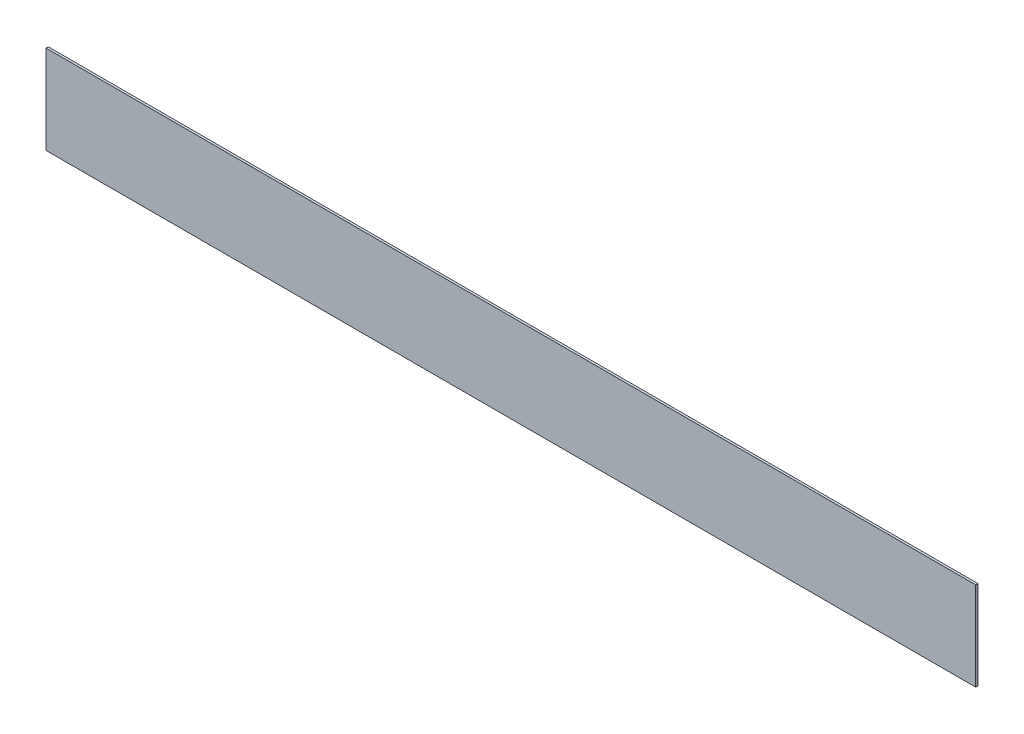
ISO-10303-21;
HEADER;
FILE_DESCRIPTION(('STEP AP214'),'2;1');
FILE_NAME('part.step','',(''),(''),'','','');
FILE_SCHEMA(('AUTOMOTIVE_DESIGN { 1 0 10303 214 1 1 1 1 }'));
ENDSEC;
DATA;
#1=APPLICATION_CONTEXT('core data for automotive mechanical design processes');
#2=APPLICATION_PROTOCOL_DEFINITION('international standard','automotive_design',2000,#1);
#3=PRODUCT_CONTEXT('',#1,'mechanical');
#4=PRODUCT('Part','Part','',(#3));
#5=PRODUCT_RELATED_PRODUCT_CATEGORY('part','',(#4));
#6=PRODUCT_DEFINITION_FORMATION('','',#4);
#7=PRODUCT_DEFINITION_CONTEXT('part definition',#1,'design');
#8=PRODUCT_DEFINITION('design','',#6,#7);
#9=PRODUCT_DEFINITION_SHAPE('','',#8);
#10=(LENGTH_UNIT() NAMED_UNIT(*) SI_UNIT(.MILLI.,.METRE.));
#11=(NAMED_UNIT(*) PLANE_ANGLE_UNIT() SI_UNIT($,.RADIAN.));
#12=(NAMED_UNIT(*) SI_UNIT($,.STERADIAN.) SOLID_ANGLE_UNIT());
#13=UNCERTAINTY_MEASURE_WITH_UNIT(LENGTH_MEASURE(1.E-05),#10,'distance_accuracy_value','');
#14=(GEOMETRIC_REPRESENTATION_CONTEXT(3) GLOBAL_UNCERTAINTY_ASSIGNED_CONTEXT((#13)) GLOBAL_UNIT_ASSIGNED_CONTEXT((#10,
#11,#12)) REPRESENTATION_CONTEXT('',''));
#15=CARTESIAN_POINT('',(0.,0.,0.));
#16=DIRECTION('',(0.,0.,1.));
#17=DIRECTION('',(1.,0.,0.));
#18=AXIS2_PLACEMENT_3D('',#15,#16,#17);
#19=CARTESIAN_POINT('',(0.,0.,5.));
#20=DIRECTION('',(1.,0.,0.));
#21=DIRECTION('',(0.,0.,-1.));
#22=AXIS2_PLACEMENT_3D('',#19,#20,#21);
#23=PLANE('',#22);
#24=DIRECTION('',(0.,-1.,0.));
#25=VECTOR('',#24,1.);
#26=CARTESIAN_POINT('',(0.,0.,0.));
#27=LINE('',#26,#25);
#28=CARTESIAN_POINT('',(0.,196.,0.));
#29=VERTEX_POINT('',#28);
#30=CARTESIAN_POINT('',(0.,0.,0.));
#31=VERTEX_POINT('',#30);
#32=EDGE_CURVE('E97',#29,#31,#27,.T.);
#33=ORIENTED_EDGE('',*,*,#32,.T.);
#34=DIRECTION('',(0.,0.,-1.));
#35=VECTOR('',#34,1.);
#36=CARTESIAN_POINT('',(0.,0.,5.));
#37=LINE('',#36,#35);
#38=CARTESIAN_POINT('',(0.,0.,5.));
#39=VERTEX_POINT('',#38);
#40=EDGE_CURVE('E11',#39,#31,#37,.T.);
#41=ORIENTED_EDGE('',*,*,#40,.F.);
#42=DIRECTION('',(0.,-1.,0.));
#43=VECTOR('',#42,1.);
#44=CARTESIAN_POINT('',(0.,0.,5.));
#45=LINE('',#44,#43);
#46=CARTESIAN_POINT('',(0.,196.,5.));
#47=VERTEX_POINT('',#46);
#48=EDGE_CURVE('E85',#47,#39,#45,.T.);
#49=ORIENTED_EDGE('',*,*,#48,.F.);
#50=DIRECTION('',(0.,0.,-1.));
#51=VECTOR('',#50,1.);
#52=CARTESIAN_POINT('',(0.,196.,5.));
#53=LINE('',#52,#51);
#54=EDGE_CURVE('E93',#47,#29,#53,.T.);
#55=ORIENTED_EDGE('',*,*,#54,.T.);
#56=EDGE_LOOP('',(#33,#41,#49,#55));
#57=FACE_BOUND('',#56,.T.);
#58=ADVANCED_FACE('F34',(#57),#23,.F.);
#59=CARTESIAN_POINT('',(0.,0.,5.));
#60=DIRECTION('',(0.,1.,0.));
#61=DIRECTION('',(0.,0.,1.));
#62=AXIS2_PLACEMENT_3D('',#59,#60,#61);
#63=PLANE('',#62);
#64=DIRECTION('',(1.,0.,0.));
#65=VECTOR('',#64,1.);
#66=CARTESIAN_POINT('',(0.,0.,0.));
#67=LINE('',#66,#65);
#68=CARTESIAN_POINT('',(2056.,0.,0.));
#69=VERTEX_POINT('',#68);
#70=EDGE_CURVE('E89',#31,#69,#67,.T.);
#71=ORIENTED_EDGE('',*,*,#70,.T.);
#72=DIRECTION('',(0.,0.,-1.));
#73=VECTOR('',#72,1.);
#74=CARTESIAN_POINT('',(2056.,0.,5.));
#75=LINE('',#74,#73);
#76=CARTESIAN_POINT('',(2056.,0.,5.));
#77=VERTEX_POINT('',#76);
#78=EDGE_CURVE('E42',#77,#69,#75,.T.);
#79=ORIENTED_EDGE('',*,*,#78,.F.);
#80=DIRECTION('',(1.,0.,0.));
#81=VECTOR('',#80,1.);
#82=CARTESIAN_POINT('',(0.,0.,5.));
#83=LINE('',#82,#81);
#84=EDGE_CURVE('E80',#39,#77,#83,.T.);
#85=ORIENTED_EDGE('',*,*,#84,.F.);
#86=ORIENTED_EDGE('',*,*,#40,.T.);
#87=EDGE_LOOP('',(#71,#79,#85,#86));
#88=FACE_BOUND('',#87,.T.);
#89=ADVANCED_FACE('F88',(#88),#63,.F.);
#90=CARTESIAN_POINT('',(2056.,0.,5.));
#91=DIRECTION('',(-1.,0.,0.));
#92=DIRECTION('',(0.,0.,1.));
#93=AXIS2_PLACEMENT_3D('',#90,#91,#92);
#94=PLANE('',#93);
#95=DIRECTION('',(0.,1.,0.));
#96=VECTOR('',#95,1.);
#97=CARTESIAN_POINT('',(2056.,0.,0.));
#98=LINE('',#97,#96);
#99=CARTESIAN_POINT('',(2056.,196.,0.));
#100=VERTEX_POINT('',#99);
#101=EDGE_CURVE('E67',#69,#100,#98,.T.);
#102=ORIENTED_EDGE('',*,*,#101,.T.);
#103=DIRECTION('',(0.,0.,-1.));
#104=VECTOR('',#103,1.);
#105=CARTESIAN_POINT('',(2056.,196.,5.));
#106=LINE('',#105,#104);
#107=CARTESIAN_POINT('',(2056.,196.,5.));
#108=VERTEX_POINT('',#107);
#109=EDGE_CURVE('E90',#108,#100,#106,.T.);
#110=ORIENTED_EDGE('',*,*,#109,.F.);
#111=DIRECTION('',(0.,1.,0.));
#112=VECTOR('',#111,1.);
#113=CARTESIAN_POINT('',(2056.,0.,5.));
#114=LINE('',#113,#112);
#115=EDGE_CURVE('E83',#77,#108,#114,.T.);
#116=ORIENTED_EDGE('',*,*,#115,.F.);
#117=ORIENTED_EDGE('',*,*,#78,.T.);
#118=EDGE_LOOP('',(#102,#110,#116,#117));
#119=FACE_BOUND('',#118,.T.);
#120=ADVANCED_FACE('F91',(#119),#94,.F.);
#121=CARTESIAN_POINT('',(0.,196.,5.));
#122=DIRECTION('',(0.,-1.,0.));
#123=DIRECTION('',(0.,0.,-1.));
#124=AXIS2_PLACEMENT_3D('',#121,#122,#123);
#125=PLANE('',#124);
#126=DIRECTION('',(-1.,0.,0.));
#127=VECTOR('',#126,1.);
#128=CARTESIAN_POINT('',(0.,196.,0.));
#129=LINE('',#128,#127);
#130=EDGE_CURVE('E73',#100,#29,#129,.T.);
#131=ORIENTED_EDGE('',*,*,#130,.T.);
#132=ORIENTED_EDGE('',*,*,#54,.F.);
#133=DIRECTION('',(-1.,0.,0.));
#134=VECTOR('',#133,1.);
#135=CARTESIAN_POINT('',(0.,196.,5.));
#136=LINE('',#135,#134);
#137=EDGE_CURVE('E50',#108,#47,#136,.T.);
#138=ORIENTED_EDGE('',*,*,#137,.F.);
#139=ORIENTED_EDGE('',*,*,#109,.T.);
#140=EDGE_LOOP('',(#131,#132,#138,#139));
#141=FACE_BOUND('',#140,.T.);
#142=ADVANCED_FACE('F104',(#141),#125,.F.);
#143=CARTESIAN_POINT('',(0.,0.,5.));
#144=DIRECTION('',(0.,0.,-1.));
#145=DIRECTION('',(-1.,0.,0.));
#146=AXIS2_PLACEMENT_3D('',#143,#144,#145);
#147=PLANE('',#146);
#148=ORIENTED_EDGE('',*,*,#48,.T.);
#149=ORIENTED_EDGE('',*,*,#84,.T.);
#150=ORIENTED_EDGE('',*,*,#115,.T.);
#151=ORIENTED_EDGE('',*,*,#137,.T.);
#152=EDGE_LOOP('',(#148,#149,#150,#151));
#153=FACE_BOUND('',#152,.T.);
#154=ADVANCED_FACE('F81',(#153),#147,.F.);
#155=CARTESIAN_POINT('',(0.,0.,0.));
#156=DIRECTION('',(0.,0.,-1.));
#157=DIRECTION('',(-1.,0.,0.));
#158=AXIS2_PLACEMENT_3D('',#155,#156,#157);
#159=PLANE('',#158);
#160=ORIENTED_EDGE('',*,*,#32,.F.);
#161=ORIENTED_EDGE('',*,*,#130,.F.);
#162=ORIENTED_EDGE('',*,*,#101,.F.);
#163=ORIENTED_EDGE('',*,*,#70,.F.);
#164=EDGE_LOOP('',(#160,#161,#162,#163));
#165=FACE_BOUND('',#164,.T.);
#166=ADVANCED_FACE('F107',(#165),#159,.T.);
#167=CLOSED_SHELL('',(#58,#89,#120,#142,#154,#166));
#168=MANIFOLD_SOLID_BREP('B2',#167);
#169=ADVANCED_BREP_SHAPE_REPRESENTATION('',(#18,#168),#14);
#170=SHAPE_DEFINITION_REPRESENTATION(#9,#169);
ENDSEC;
END-ISO-10303-21;
